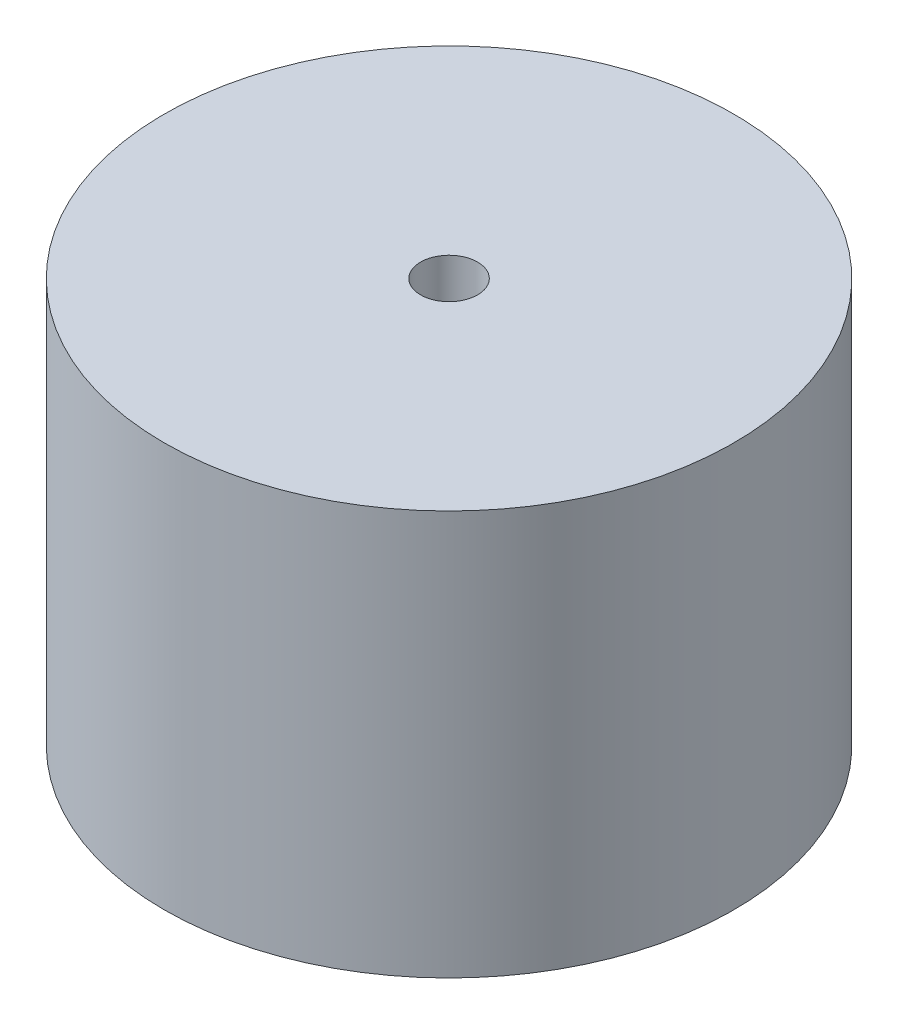
ISO-10303-21;
HEADER;
FILE_DESCRIPTION(('STEP AP214'),'2;1');
FILE_NAME('part.step','',(''),(''),'','','');
FILE_SCHEMA(('AUTOMOTIVE_DESIGN { 1 0 10303 214 1 1 1 1 }'));
ENDSEC;
DATA;
#1=APPLICATION_CONTEXT('core data for automotive mechanical design processes');
#2=APPLICATION_PROTOCOL_DEFINITION('international standard','automotive_design',2000,#1);
#3=PRODUCT_CONTEXT('',#1,'mechanical');
#4=PRODUCT('Part','Part','',(#3));
#5=PRODUCT_RELATED_PRODUCT_CATEGORY('part','',(#4));
#6=PRODUCT_DEFINITION_FORMATION('','',#4);
#7=PRODUCT_DEFINITION_CONTEXT('part definition',#1,'design');
#8=PRODUCT_DEFINITION('design','',#6,#7);
#9=PRODUCT_DEFINITION_SHAPE('','',#8);
#10=(LENGTH_UNIT() NAMED_UNIT(*) SI_UNIT(.MILLI.,.METRE.));
#11=(NAMED_UNIT(*) PLANE_ANGLE_UNIT() SI_UNIT($,.RADIAN.));
#12=(NAMED_UNIT(*) SI_UNIT($,.STERADIAN.) SOLID_ANGLE_UNIT());
#13=UNCERTAINTY_MEASURE_WITH_UNIT(LENGTH_MEASURE(1.E-05),#10,'distance_accuracy_value','');
#14=(GEOMETRIC_REPRESENTATION_CONTEXT(3) GLOBAL_UNCERTAINTY_ASSIGNED_CONTEXT((#13)) GLOBAL_UNIT_ASSIGNED_CONTEXT((#10,
#11,#12)) REPRESENTATION_CONTEXT('',''));
#15=CARTESIAN_POINT('',(0.,0.,0.));
#16=DIRECTION('',(0.,0.,1.));
#17=DIRECTION('',(1.,0.,0.));
#18=AXIS2_PLACEMENT_3D('',#15,#16,#17);
#19=CARTESIAN_POINT('',(0.,18.034,0.));
#20=DIRECTION('',(0.,-1.,0.));
#21=DIRECTION('',(0.,0.,-1.));
#22=AXIS2_PLACEMENT_3D('',#19,#20,#21);
#23=CYLINDRICAL_SURFACE('',#22,12.7);
#24=CARTESIAN_POINT('',(0.,18.034,0.));
#25=DIRECTION('',(0.,1.,0.));
#26=DIRECTION('',(0.,0.,1.));
#27=AXIS2_PLACEMENT_3D('',#24,#25,#26);
#28=CIRCLE('',#27,12.7);
#29=CARTESIAN_POINT('',(0.,18.034,12.7));
#30=VERTEX_POINT('',#29);
#31=EDGE_CURVE('E10',#30,#30,#28,.T.);
#32=ORIENTED_EDGE('',*,*,#31,.F.);
#33=EDGE_LOOP('',(#32));
#34=FACE_BOUND('',#33,.T.);
#35=CARTESIAN_POINT('',(0.,0.,0.));
#36=DIRECTION('',(0.,1.,0.));
#37=DIRECTION('',(0.,0.,1.));
#38=AXIS2_PLACEMENT_3D('',#35,#36,#37);
#39=CIRCLE('',#38,12.7);
#40=CARTESIAN_POINT('',(0.,0.,12.7));
#41=VERTEX_POINT('',#40);
#42=EDGE_CURVE('E34',#41,#41,#39,.T.);
#43=ORIENTED_EDGE('',*,*,#42,.T.);
#44=EDGE_LOOP('',(#43));
#45=FACE_BOUND('',#44,.T.);
#46=ADVANCED_FACE('F31',(#34,#45),#23,.T.);
#47=CARTESIAN_POINT('',(0.,18.034,0.));
#48=DIRECTION('',(0.,1.,0.));
#49=DIRECTION('',(0.,0.,1.));
#50=AXIS2_PLACEMENT_3D('',#47,#48,#49);
#51=PLANE('',#50);
#52=CARTESIAN_POINT('',(0.,18.034,0.));
#53=DIRECTION('',(0.,1.,0.));
#54=DIRECTION('',(0.,0.,1.));
#55=AXIS2_PLACEMENT_3D('',#52,#53,#54);
#56=CIRCLE('',#55,1.27);
#57=CARTESIAN_POINT('',(0.,18.034,1.27));
#58=VERTEX_POINT('',#57);
#59=EDGE_CURVE('E45',#58,#58,#56,.T.);
#60=ORIENTED_EDGE('',*,*,#59,.F.);
#61=EDGE_LOOP('',(#60));
#62=FACE_BOUND('',#61,.T.);
#63=ORIENTED_EDGE('',*,*,#31,.T.);
#64=EDGE_LOOP('',(#63));
#65=FACE_BOUND('',#64,.T.);
#66=ADVANCED_FACE('F52',(#62,#65),#51,.T.);
#67=CARTESIAN_POINT('',(0.,0.,0.));
#68=DIRECTION('',(0.,1.,0.));
#69=DIRECTION('',(0.,0.,1.));
#70=AXIS2_PLACEMENT_3D('',#67,#68,#69);
#71=PLANE('',#70);
#72=CARTESIAN_POINT('',(0.,0.,0.));
#73=DIRECTION('',(0.,1.,0.));
#74=DIRECTION('',(0.,0.,1.));
#75=AXIS2_PLACEMENT_3D('',#72,#73,#74);
#76=CIRCLE('',#75,1.27);
#77=CARTESIAN_POINT('',(0.,0.,1.27));
#78=VERTEX_POINT('',#77);
#79=EDGE_CURVE('E41',#78,#78,#76,.F.);
#80=ORIENTED_EDGE('',*,*,#79,.F.);
#81=EDGE_LOOP('',(#80));
#82=FACE_BOUND('',#81,.T.);
#83=ORIENTED_EDGE('',*,*,#42,.F.);
#84=EDGE_LOOP('',(#83));
#85=FACE_BOUND('',#84,.T.);
#86=ADVANCED_FACE('F54',(#82,#85),#71,.F.);
#87=CARTESIAN_POINT('',(0.,-0.001000000000001,0.));
#88=DIRECTION('',(0.,1.,0.));
#89=DIRECTION('',(0.,0.,1.));
#90=AXIS2_PLACEMENT_3D('',#87,#88,#89);
#91=CYLINDRICAL_SURFACE('',#90,1.27);
#92=ORIENTED_EDGE('',*,*,#59,.T.);
#93=EDGE_LOOP('',(#92));
#94=FACE_BOUND('',#93,.T.);
#95=ORIENTED_EDGE('',*,*,#79,.T.);
#96=EDGE_LOOP('',(#95));
#97=FACE_BOUND('',#96,.T.);
#98=ADVANCED_FACE('F49',(#94,#97),#91,.F.);
#99=CLOSED_SHELL('',(#46,#66,#86,#98));
#100=MANIFOLD_SOLID_BREP('B2',#99);
#101=ADVANCED_BREP_SHAPE_REPRESENTATION('',(#18,#100),#14);
#102=SHAPE_DEFINITION_REPRESENTATION(#9,#101);
ENDSEC;
END-ISO-10303-21;
